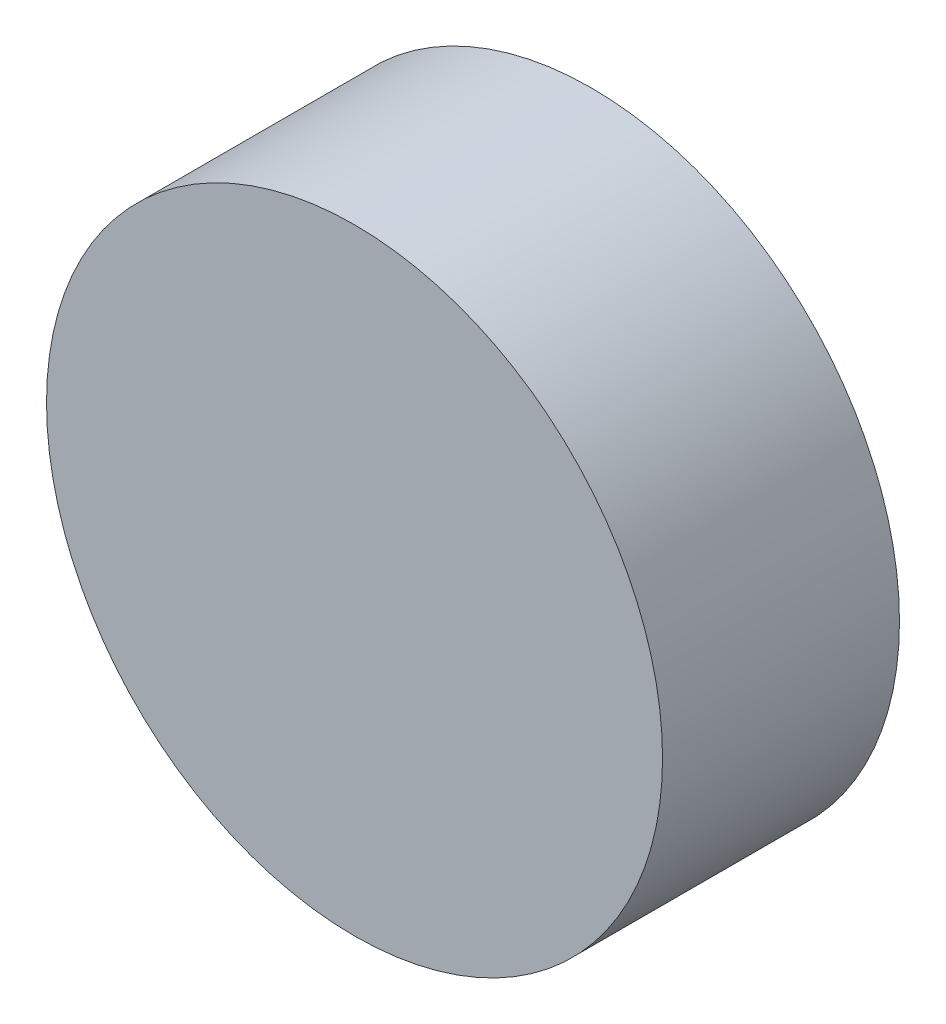
ISO-10303-21;
HEADER;
FILE_DESCRIPTION(('STEP AP214'),'2;1');
FILE_NAME('part.step','',(''),(''),'','','');
FILE_SCHEMA(('AUTOMOTIVE_DESIGN { 1 0 10303 214 1 1 1 1 }'));
ENDSEC;
DATA;
#1=APPLICATION_CONTEXT('core data for automotive mechanical design processes');
#2=APPLICATION_PROTOCOL_DEFINITION('international standard','automotive_design',2000,#1);
#3=PRODUCT_CONTEXT('',#1,'mechanical');
#4=PRODUCT('Part','Part','',(#3));
#5=PRODUCT_RELATED_PRODUCT_CATEGORY('part','',(#4));
#6=PRODUCT_DEFINITION_FORMATION('','',#4);
#7=PRODUCT_DEFINITION_CONTEXT('part definition',#1,'design');
#8=PRODUCT_DEFINITION('design','',#6,#7);
#9=PRODUCT_DEFINITION_SHAPE('','',#8);
#10=(LENGTH_UNIT() NAMED_UNIT(*) SI_UNIT(.MILLI.,.METRE.));
#11=(NAMED_UNIT(*) PLANE_ANGLE_UNIT() SI_UNIT($,.RADIAN.));
#12=(NAMED_UNIT(*) SI_UNIT($,.STERADIAN.) SOLID_ANGLE_UNIT());
#13=UNCERTAINTY_MEASURE_WITH_UNIT(LENGTH_MEASURE(1.E-05),#10,'distance_accuracy_value','');
#14=(GEOMETRIC_REPRESENTATION_CONTEXT(3) GLOBAL_UNCERTAINTY_ASSIGNED_CONTEXT((#13)) GLOBAL_UNIT_ASSIGNED_CONTEXT((#10,
#11,#12)) REPRESENTATION_CONTEXT('',''));
#15=CARTESIAN_POINT('',(0.,0.,0.));
#16=DIRECTION('',(0.,0.,1.));
#17=DIRECTION('',(1.,0.,0.));
#18=AXIS2_PLACEMENT_3D('',#15,#16,#17);
#19=CARTESIAN_POINT('',(0.,0.,10.));
#20=DIRECTION('',(0.,0.,-1.));
#21=DIRECTION('',(-1.,0.,0.));
#22=AXIS2_PLACEMENT_3D('',#19,#20,#21);
#23=CYLINDRICAL_SURFACE('',#22,13.);
#24=CARTESIAN_POINT('',(0.,0.,10.));
#25=DIRECTION('',(0.,0.,1.));
#26=DIRECTION('',(1.,0.,0.));
#27=AXIS2_PLACEMENT_3D('',#24,#25,#26);
#28=CIRCLE('',#27,13.);
#29=CARTESIAN_POINT('',(13.,0.,10.));
#30=VERTEX_POINT('',#29);
#31=EDGE_CURVE('E10',#30,#30,#28,.T.);
#32=ORIENTED_EDGE('',*,*,#31,.F.);
#33=EDGE_LOOP('',(#32));
#34=FACE_BOUND('',#33,.T.);
#35=CARTESIAN_POINT('',(0.,0.,0.));
#36=DIRECTION('',(0.,0.,1.));
#37=DIRECTION('',(1.,0.,0.));
#38=AXIS2_PLACEMENT_3D('',#35,#36,#37);
#39=CIRCLE('',#38,13.);
#40=CARTESIAN_POINT('',(13.,0.,0.));
#41=VERTEX_POINT('',#40);
#42=EDGE_CURVE('E33',#41,#41,#39,.T.);
#43=ORIENTED_EDGE('',*,*,#42,.T.);
#44=EDGE_LOOP('',(#43));
#45=FACE_BOUND('',#44,.T.);
#46=ADVANCED_FACE('F30',(#34,#45),#23,.T.);
#47=CARTESIAN_POINT('',(0.,0.,10.));
#48=DIRECTION('',(0.,0.,1.));
#49=DIRECTION('',(1.,0.,0.));
#50=AXIS2_PLACEMENT_3D('',#47,#48,#49);
#51=PLANE('',#50);
#52=ORIENTED_EDGE('',*,*,#31,.T.);
#53=EDGE_LOOP('',(#52));
#54=FACE_BOUND('',#53,.T.);
#55=ADVANCED_FACE('F45',(#54),#51,.T.);
#56=CARTESIAN_POINT('',(0.,0.,0.));
#57=DIRECTION('',(0.,0.,1.));
#58=DIRECTION('',(1.,0.,0.));
#59=AXIS2_PLACEMENT_3D('',#56,#57,#58);
#60=PLANE('',#59);
#61=ORIENTED_EDGE('',*,*,#42,.F.);
#62=EDGE_LOOP('',(#61));
#63=FACE_BOUND('',#62,.T.);
#64=ADVANCED_FACE('F43',(#63),#60,.F.);
#65=CLOSED_SHELL('',(#46,#55,#64));
#66=MANIFOLD_SOLID_BREP('B2',#65);
#67=ADVANCED_BREP_SHAPE_REPRESENTATION('',(#18,#66),#14);
#68=SHAPE_DEFINITION_REPRESENTATION(#9,#67);
ENDSEC;
END-ISO-10303-21;
